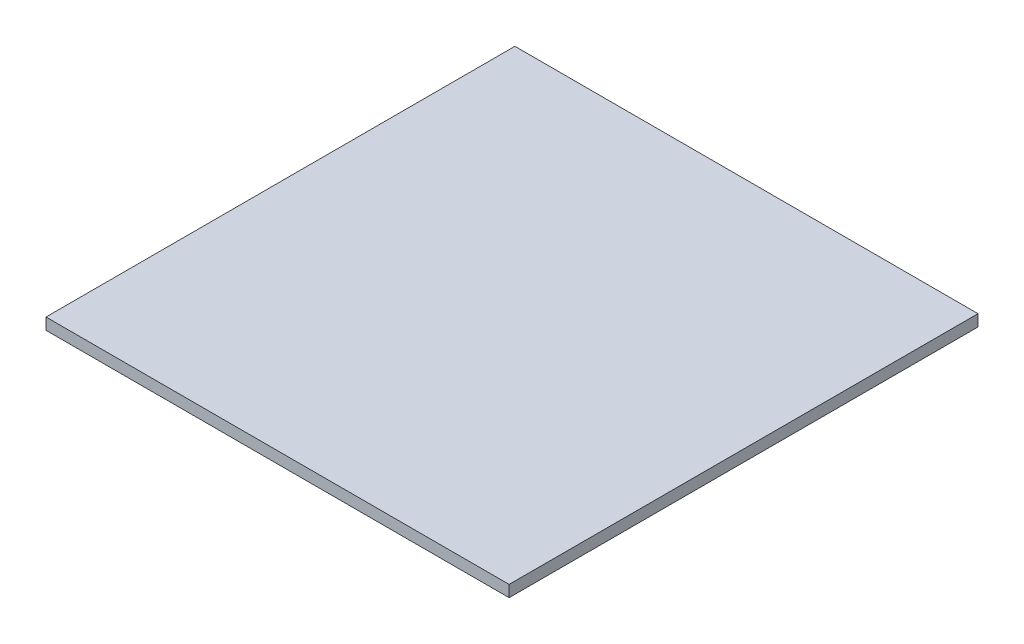
ISO-10303-21;
HEADER;
FILE_DESCRIPTION(('STEP AP214'),'2;1');
FILE_NAME('part.step','',(''),(''),'','','');
FILE_SCHEMA(('AUTOMOTIVE_DESIGN { 1 0 10303 214 1 1 1 1 }'));
ENDSEC;
DATA;
#1=APPLICATION_CONTEXT('core data for automotive mechanical design processes');
#2=APPLICATION_PROTOCOL_DEFINITION('international standard','automotive_design',2000,#1);
#3=PRODUCT_CONTEXT('',#1,'mechanical');
#4=PRODUCT('Part','Part','',(#3));
#5=PRODUCT_RELATED_PRODUCT_CATEGORY('part','',(#4));
#6=PRODUCT_DEFINITION_FORMATION('','',#4);
#7=PRODUCT_DEFINITION_CONTEXT('part definition',#1,'design');
#8=PRODUCT_DEFINITION('design','',#6,#7);
#9=PRODUCT_DEFINITION_SHAPE('','',#8);
#10=(LENGTH_UNIT() NAMED_UNIT(*) SI_UNIT(.MILLI.,.METRE.));
#11=(NAMED_UNIT(*) PLANE_ANGLE_UNIT() SI_UNIT($,.RADIAN.));
#12=(NAMED_UNIT(*) SI_UNIT($,.STERADIAN.) SOLID_ANGLE_UNIT());
#13=UNCERTAINTY_MEASURE_WITH_UNIT(LENGTH_MEASURE(1.E-05),#10,'distance_accuracy_value','');
#14=(GEOMETRIC_REPRESENTATION_CONTEXT(3) GLOBAL_UNCERTAINTY_ASSIGNED_CONTEXT((#13)) GLOBAL_UNIT_ASSIGNED_CONTEXT((#10,
#11,#12)) REPRESENTATION_CONTEXT('',''));
#15=CARTESIAN_POINT('',(0.,0.,0.));
#16=DIRECTION('',(0.,0.,1.));
#17=DIRECTION('',(1.,0.,0.));
#18=AXIS2_PLACEMENT_3D('',#15,#16,#17);
#19=CARTESIAN_POINT('',(0.,12.,0.));
#20=DIRECTION('',(1.,0.,0.));
#21=DIRECTION('',(0.,0.,-1.));
#22=AXIS2_PLACEMENT_3D('',#19,#20,#21);
#23=PLANE('',#22);
#24=DIRECTION('',(0.,0.,1.));
#25=VECTOR('',#24,1.);
#26=CARTESIAN_POINT('',(0.,0.,0.));
#27=LINE('',#26,#25);
#28=CARTESIAN_POINT('',(0.,0.,-488.));
#29=VERTEX_POINT('',#28);
#30=CARTESIAN_POINT('',(0.,0.,0.));
#31=VERTEX_POINT('',#30);
#32=EDGE_CURVE('E107',#29,#31,#27,.T.);
#33=ORIENTED_EDGE('',*,*,#32,.T.);
#34=DIRECTION('',(0.,-1.,0.));
#35=VECTOR('',#34,1.);
#36=CARTESIAN_POINT('',(0.,12.,0.));
#37=LINE('',#36,#35);
#38=CARTESIAN_POINT('',(0.,12.,0.));
#39=VERTEX_POINT('',#38);
#40=EDGE_CURVE('E11',#39,#31,#37,.T.);
#41=ORIENTED_EDGE('',*,*,#40,.F.);
#42=DIRECTION('',(0.,0.,1.));
#43=VECTOR('',#42,1.);
#44=CARTESIAN_POINT('',(0.,12.,0.));
#45=LINE('',#44,#43);
#46=CARTESIAN_POINT('',(0.,12.,-488.));
#47=VERTEX_POINT('',#46);
#48=EDGE_CURVE('E91',#47,#39,#45,.T.);
#49=ORIENTED_EDGE('',*,*,#48,.F.);
#50=DIRECTION('',(0.,-1.,0.));
#51=VECTOR('',#50,1.);
#52=CARTESIAN_POINT('',(0.,12.,-488.));
#53=LINE('',#52,#51);
#54=EDGE_CURVE('E103',#47,#29,#53,.T.);
#55=ORIENTED_EDGE('',*,*,#54,.T.);
#56=EDGE_LOOP('',(#33,#41,#49,#55));
#57=FACE_BOUND('',#56,.T.);
#58=ADVANCED_FACE('F39',(#57),#23,.F.);
#59=CARTESIAN_POINT('',(0.,12.,0.));
#60=DIRECTION('',(0.,0.,-1.));
#61=DIRECTION('',(-1.,0.,0.));
#62=AXIS2_PLACEMENT_3D('',#59,#60,#61);
#63=PLANE('',#62);
#64=DIRECTION('',(1.,0.,0.));
#65=VECTOR('',#64,1.);
#66=CARTESIAN_POINT('',(0.,0.,0.));
#67=LINE('',#66,#65);
#68=CARTESIAN_POINT('',(482.,0.,0.));
#69=VERTEX_POINT('',#68);
#70=EDGE_CURVE('E96',#31,#69,#67,.T.);
#71=ORIENTED_EDGE('',*,*,#70,.T.);
#72=DIRECTION('',(0.,-1.,0.));
#73=VECTOR('',#72,1.);
#74=CARTESIAN_POINT('',(482.,12.,0.));
#75=LINE('',#74,#73);
#76=CARTESIAN_POINT('',(482.,12.,0.));
#77=VERTEX_POINT('',#76);
#78=EDGE_CURVE('E48',#77,#69,#75,.T.);
#79=ORIENTED_EDGE('',*,*,#78,.F.);
#80=DIRECTION('',(1.,0.,0.));
#81=VECTOR('',#80,1.);
#82=CARTESIAN_POINT('',(0.,12.,0.));
#83=LINE('',#82,#81);
#84=EDGE_CURVE('E86',#39,#77,#83,.T.);
#85=ORIENTED_EDGE('',*,*,#84,.F.);
#86=ORIENTED_EDGE('',*,*,#40,.T.);
#87=EDGE_LOOP('',(#71,#79,#85,#86));
#88=FACE_BOUND('',#87,.T.);
#89=ADVANCED_FACE('F95',(#88),#63,.F.);
#90=CARTESIAN_POINT('',(482.,12.,0.));
#91=DIRECTION('',(-1.,0.,0.));
#92=DIRECTION('',(0.,0.,1.));
#93=AXIS2_PLACEMENT_3D('',#90,#91,#92);
#94=PLANE('',#93);
#95=DIRECTION('',(0.,0.,-1.));
#96=VECTOR('',#95,1.);
#97=CARTESIAN_POINT('',(482.,0.,0.));
#98=LINE('',#97,#96);
#99=CARTESIAN_POINT('',(482.,0.,-488.));
#100=VERTEX_POINT('',#99);
#101=EDGE_CURVE('E73',#69,#100,#98,.T.);
#102=ORIENTED_EDGE('',*,*,#101,.T.);
#103=DIRECTION('',(0.,-1.,0.));
#104=VECTOR('',#103,1.);
#105=CARTESIAN_POINT('',(482.,12.,-488.));
#106=LINE('',#105,#104);
#107=CARTESIAN_POINT('',(482.,12.,-488.));
#108=VERTEX_POINT('',#107);
#109=EDGE_CURVE('E98',#108,#100,#106,.T.);
#110=ORIENTED_EDGE('',*,*,#109,.F.);
#111=DIRECTION('',(0.,0.,-1.));
#112=VECTOR('',#111,1.);
#113=CARTESIAN_POINT('',(482.,12.,0.));
#114=LINE('',#113,#112);
#115=EDGE_CURVE('E89',#77,#108,#114,.T.);
#116=ORIENTED_EDGE('',*,*,#115,.F.);
#117=ORIENTED_EDGE('',*,*,#78,.T.);
#118=EDGE_LOOP('',(#102,#110,#116,#117));
#119=FACE_BOUND('',#118,.T.);
#120=ADVANCED_FACE('F99',(#119),#94,.F.);
#121=CARTESIAN_POINT('',(0.,12.,-488.));
#122=DIRECTION('',(0.,0.,1.));
#123=DIRECTION('',(1.,0.,0.));
#124=AXIS2_PLACEMENT_3D('',#121,#122,#123);
#125=PLANE('',#124);
#126=DIRECTION('',(-1.,0.,0.));
#127=VECTOR('',#126,1.);
#128=CARTESIAN_POINT('',(0.,0.,-488.));
#129=LINE('',#128,#127);
#130=EDGE_CURVE('E79',#100,#29,#129,.T.);
#131=ORIENTED_EDGE('',*,*,#130,.T.);
#132=ORIENTED_EDGE('',*,*,#54,.F.);
#133=DIRECTION('',(-1.,0.,0.));
#134=VECTOR('',#133,1.);
#135=CARTESIAN_POINT('',(0.,12.,-488.));
#136=LINE('',#135,#134);
#137=EDGE_CURVE('E56',#108,#47,#136,.T.);
#138=ORIENTED_EDGE('',*,*,#137,.F.);
#139=ORIENTED_EDGE('',*,*,#109,.T.);
#140=EDGE_LOOP('',(#131,#132,#138,#139));
#141=FACE_BOUND('',#140,.T.);
#142=ADVANCED_FACE('F120',(#141),#125,.F.);
#143=CARTESIAN_POINT('',(0.,12.,0.));
#144=DIRECTION('',(0.,-1.,0.));
#145=DIRECTION('',(0.,0.,-1.));
#146=AXIS2_PLACEMENT_3D('',#143,#144,#145);
#147=PLANE('',#146);
#148=ORIENTED_EDGE('',*,*,#48,.T.);
#149=ORIENTED_EDGE('',*,*,#84,.T.);
#150=ORIENTED_EDGE('',*,*,#115,.T.);
#151=ORIENTED_EDGE('',*,*,#137,.T.);
#152=EDGE_LOOP('',(#148,#149,#150,#151));
#153=FACE_BOUND('',#152,.T.);
#154=ADVANCED_FACE('F87',(#153),#147,.F.);
#155=CARTESIAN_POINT('',(0.,0.,0.));
#156=DIRECTION('',(0.,-1.,0.));
#157=DIRECTION('',(0.,0.,-1.));
#158=AXIS2_PLACEMENT_3D('',#155,#156,#157);
#159=PLANE('',#158);
#160=ORIENTED_EDGE('',*,*,#32,.F.);
#161=ORIENTED_EDGE('',*,*,#130,.F.);
#162=ORIENTED_EDGE('',*,*,#101,.F.);
#163=ORIENTED_EDGE('',*,*,#70,.F.);
#164=EDGE_LOOP('',(#160,#161,#162,#163));
#165=FACE_BOUND('',#164,.T.);
#166=ADVANCED_FACE('F123',(#165),#159,.T.);
#167=CLOSED_SHELL('',(#58,#89,#120,#142,#154,#166));
#168=MANIFOLD_SOLID_BREP('B2',#167);
#169=ADVANCED_BREP_SHAPE_REPRESENTATION('',(#18,#168),#14);
#170=SHAPE_DEFINITION_REPRESENTATION(#9,#169);
ENDSEC;
END-ISO-10303-21;
